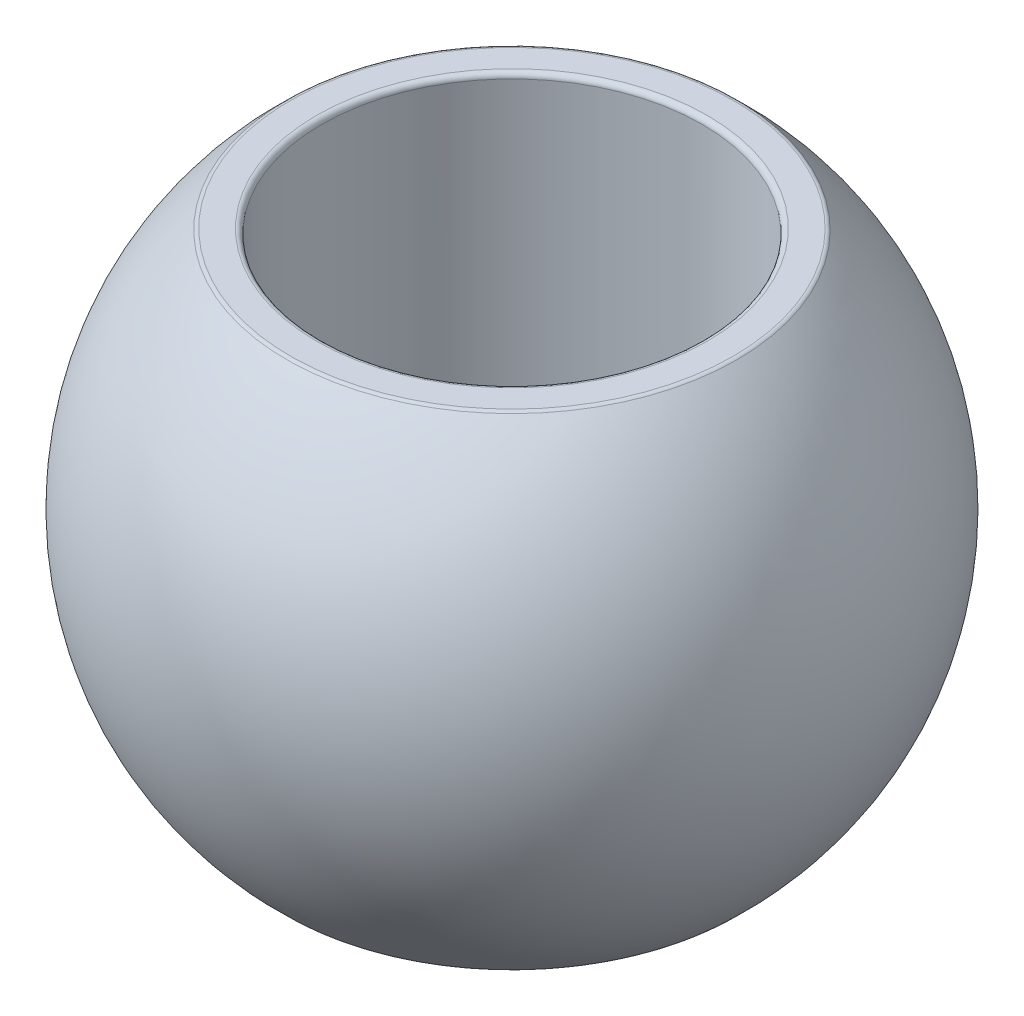
ISO-10303-21;
HEADER;
FILE_DESCRIPTION(('STEP AP214'),'2;1');
FILE_NAME('part.step','',(''),(''),'','','');
FILE_SCHEMA(('AUTOMOTIVE_DESIGN { 1 0 10303 214 1 1 1 1 }'));
ENDSEC;
DATA;
#1=APPLICATION_CONTEXT('core data for automotive mechanical design processes');
#2=APPLICATION_PROTOCOL_DEFINITION('international standard','automotive_design',2000,#1);
#3=PRODUCT_CONTEXT('',#1,'mechanical');
#4=PRODUCT('Part','Part','',(#3));
#5=PRODUCT_RELATED_PRODUCT_CATEGORY('part','',(#4));
#6=PRODUCT_DEFINITION_FORMATION('','',#4);
#7=PRODUCT_DEFINITION_CONTEXT('part definition',#1,'design');
#8=PRODUCT_DEFINITION('design','',#6,#7);
#9=PRODUCT_DEFINITION_SHAPE('','',#8);
#10=(LENGTH_UNIT() NAMED_UNIT(*) SI_UNIT(.MILLI.,.METRE.));
#11=(NAMED_UNIT(*) PLANE_ANGLE_UNIT() SI_UNIT($,.RADIAN.));
#12=(NAMED_UNIT(*) SI_UNIT($,.STERADIAN.) SOLID_ANGLE_UNIT());
#13=UNCERTAINTY_MEASURE_WITH_UNIT(LENGTH_MEASURE(1.E-05),#10,'distance_accuracy_value','');
#14=(GEOMETRIC_REPRESENTATION_CONTEXT(3) GLOBAL_UNCERTAINTY_ASSIGNED_CONTEXT((#13)) GLOBAL_UNIT_ASSIGNED_CONTEXT((#10,
#11,#12)) REPRESENTATION_CONTEXT('',''));
#15=CARTESIAN_POINT('',(0.,0.,0.));
#16=DIRECTION('',(0.,0.,1.));
#17=DIRECTION('',(1.,0.,0.));
#18=AXIS2_PLACEMENT_3D('',#15,#16,#17);
#19=CARTESIAN_POINT('',(0.,0.,0.));
#20=DIRECTION('',(0.,1.,0.));
#21=DIRECTION('',(1.,0.,0.));
#22=AXIS2_PLACEMENT_3D('',#19,#20,#21);
#23=SPHERICAL_SURFACE('',#22,19.05);
#24=CARTESIAN_POINT('',(0.,-13.9192,0.));
#25=DIRECTION('',(0.,1.,0.));
#26=DIRECTION('',(-1.,0.,0.));
#27=AXIS2_PLACEMENT_3D('',#24,#25,#26);
#28=CIRCLE('',#27,13.0060897797916);
#29=CARTESIAN_POINT('',(13.0060897797916,-13.9192,0.));
#30=VERTEX_POINT('',#29);
#31=EDGE_CURVE('E60',#30,#30,#28,.T.);
#32=CARTESIAN_POINT('',(0.,13.9192,0.));
#33=DIRECTION('',(0.,-1.,0.));
#34=DIRECTION('',(1.,0.,0.));
#35=AXIS2_PLACEMENT_3D('',#32,#33,#34);
#36=CIRCLE('',#35,13.0060897797916);
#37=CARTESIAN_POINT('',(13.0060897797916,13.9192,0.));
#38=VERTEX_POINT('',#37);
#39=EDGE_CURVE('E63',#38,#38,#36,.T.);
#40=CARTESIAN_POINT('',(13.0060897797916,-13.9192,0.));
#41=CARTESIAN_POINT('',(13.2436781468951,-13.69720832707,0.));
#42=CARTESIAN_POINT('',(13.4755717006346,-13.4691230465657,0.));
#43=CARTESIAN_POINT('',(13.9273860276897,-13.0013871060489,0.));
#44=CARTESIAN_POINT('',(14.1473068010051,-12.7617364460365,0.));
#45=CARTESIAN_POINT('',(14.5745924135157,-12.2714915821444,0.));
#46=CARTESIAN_POINT('',(14.7819572527109,-12.0208973782648,0.));
#47=CARTESIAN_POINT('',(15.1835891685933,-11.5094240745473,0.));
#48=CARTESIAN_POINT('',(15.3778562452805,-11.2485449747094,0.));
#49=CARTESIAN_POINT('',(15.7527828900079,-10.7171853119996,0.));
#50=CARTESIAN_POINT('',(15.9334424580481,-10.4467047491278,0.));
#51=CARTESIAN_POINT('',(16.2806806151524,-9.89685134671473,0.));
#52=CARTESIAN_POINT('',(16.4472592042165,-9.6174785071736,0.));
#53=CARTESIAN_POINT('',(16.7658986844473,-9.05057289254917,0.));
#54=CARTESIAN_POINT('',(16.917959575614,-8.76304011746588,0.));
#55=CARTESIAN_POINT('',(17.2071650425348,-8.18056840598082,0.));
#56=CARTESIAN_POINT('',(17.3443096182889,-7.88562946957907,0.));
#57=CARTESIAN_POINT('',(17.6033229282809,-7.28911861366565,0.));
#58=CARTESIAN_POINT('',(17.7251916625187,-6.98754669415399,0.));
#59=CARTESIAN_POINT('',(17.9533338120104,-6.37856044155972,0.));
#60=CARTESIAN_POINT('',(18.0596072272641,-6.07114610847711,0.));
#61=CARTESIAN_POINT('',(18.2562801435168,-5.45128091332497,0.));
#62=CARTESIAN_POINT('',(18.3466796445158,-5.13883005125544,0.));
#63=CARTESIAN_POINT('',(18.5113677505789,-4.50971088615863,0.));
#64=CARTESIAN_POINT('',(18.585656355643,-4.19304258313136,0.));
#65=CARTESIAN_POINT('',(18.7179279227096,-3.55631868008553,0.));
#66=CARTESIAN_POINT('',(18.775910884712,-3.23626308006697,0.));
#67=CARTESIAN_POINT('',(18.8754191636857,-2.59360360679846,0.));
#68=CARTESIAN_POINT('',(18.9169444806571,-2.2709997335485,0.));
#69=CARTESIAN_POINT('',(18.9834286112086,-1.62408941785527,0.));
#70=CARTESIAN_POINT('',(19.0083874247889,-1.29978297541199,0.));
#71=CARTESIAN_POINT('',(19.0416731191845,-0.650317688645804,0.));
#72=CARTESIAN_POINT('',(19.05,-0.3251588443229,0.));
#73=CARTESIAN_POINT('',(19.05,0.325158844322907,0.));
#74=CARTESIAN_POINT('',(19.0416731191845,0.650317688645811,0.));
#75=CARTESIAN_POINT('',(19.0083874247889,1.29978297541199,0.));
#76=CARTESIAN_POINT('',(18.9834286112086,1.62408941785527,0.));
#77=CARTESIAN_POINT('',(18.9169444806571,2.27099973354851,0.));
#78=CARTESIAN_POINT('',(18.8754191636857,2.59360360679847,0.));
#79=CARTESIAN_POINT('',(18.775910884712,3.23626308006698,0.));
#80=CARTESIAN_POINT('',(18.7179279227096,3.55631868008553,0.));
#81=CARTESIAN_POINT('',(18.585656355643,4.19304258313136,0.));
#82=CARTESIAN_POINT('',(18.5113677505789,4.50971088615864,0.));
#83=CARTESIAN_POINT('',(18.3466796445158,5.13883005125544,0.));
#84=CARTESIAN_POINT('',(18.2562801435168,5.45128091332497,0.));
#85=CARTESIAN_POINT('',(18.0596072272641,6.07114610847711,0.));
#86=CARTESIAN_POINT('',(17.9533338120104,6.37856044155972,0.));
#87=CARTESIAN_POINT('',(17.7251916625187,6.98754669415399,0.));
#88=CARTESIAN_POINT('',(17.6033229282809,7.28911861366565,0.));
#89=CARTESIAN_POINT('',(17.3443096182889,7.88562946957907,0.));
#90=CARTESIAN_POINT('',(17.2071650425348,8.18056840598083,0.));
#91=CARTESIAN_POINT('',(16.917959575614,8.76304011746588,0.));
#92=CARTESIAN_POINT('',(16.7658986844473,9.05057289254918,0.));
#93=CARTESIAN_POINT('',(16.4472592042165,9.61747850717361,0.));
#94=CARTESIAN_POINT('',(16.2806806151524,9.89685134671474,0.));
#95=CARTESIAN_POINT('',(15.9334424580481,10.4467047491278,0.));
#96=CARTESIAN_POINT('',(15.7527828900079,10.7171853119996,0.));
#97=CARTESIAN_POINT('',(15.3778562452805,11.2485449747094,0.));
#98=CARTESIAN_POINT('',(15.1835891685933,11.5094240745473,0.));
#99=CARTESIAN_POINT('',(14.7819572527109,12.0208973782648,0.));
#100=CARTESIAN_POINT('',(14.5745924135157,12.2714915821444,0.));
#101=CARTESIAN_POINT('',(14.1473068010051,12.7617364460365,0.));
#102=CARTESIAN_POINT('',(13.9273860276897,13.0013871060489,0.));
#103=CARTESIAN_POINT('',(13.4755717006346,13.4691230465657,0.));
#104=CARTESIAN_POINT('',(13.2436781468951,13.69720832707,0.));
#105=CARTESIAN_POINT('',(13.0060897797916,13.9192,0.));
#106=B_SPLINE_CURVE_WITH_KNOTS('',3,(#40,#41,#42,#43,#44,#45,#46,#47,#48,#49,#50,#51,#52,#53,
#54,#55,#56,#57,#58,#59,#60,#61,#62,#63,#64,#65,#66,#67,#68,#69,#70,#71,#72,#73,#74,#75,#76,#77,
#78,#79,#80,#81,#82,#83,#84,#85,#86,#87,#88,#89,#90,#91,#92,#93,#94,#95,#96,#97,#98,#99,#100,
#101,#102,#103,#104,#105),.UNSPECIFIED.,.F.,.F.,(4,2,2,2,2,2,2,2,2,2,2,2,2,2,2,2,2,2,2,2,2,2,2,
2,2,2,2,2,2,2,2,2,4),(0.,0.975370000208496,1.95074000041699,2.92611000062549,3.90148000083399,
4.87685000104249,5.85222000125099,6.82759000145948,7.80296000166798,8.77833000187648,
9.75370000208498,10.7290700022935,11.704440002502,12.6798100027105,13.655180002919,
14.6305500031275,15.605920003336,16.5812900035445,17.556660003753,18.5320300039615,
19.50740000417,20.4827700043784,21.4581400045869,22.4335100047954,23.4088800050039,
24.3842500052124,25.3596200054209,26.3349900056294,27.3103600058379,28.2857300060464,
29.2611000062549,30.2364700064634,31.2118400066719),.UNSPECIFIED.);
#107=EDGE_CURVE('BSEAM34',#30,#38,#106,.T.);
#108=ORIENTED_EDGE('',*,*,#31,.T.);
#109=ORIENTED_EDGE('',*,*,#39,.T.);
#110=ORIENTED_EDGE('',*,*,#107,.T.);
#111=ORIENTED_EDGE('',*,*,#107,.F.);
#112=EDGE_LOOP('',(#108,#110,#109,#111));
#113=FACE_BOUND('',#112,.T.);
#114=ADVANCED_FACE('F34',(#113),#23,.T.);
#115=CARTESIAN_POINT('',(12.9190750442901,14.,0.));
#116=DIRECTION('',(0.,-1.,0.));
#117=DIRECTION('',(1.,0.,0.));
#118=AXIS2_PLACEMENT_3D('',#115,#116,#117);
#119=PLANE('',#118);
#120=CARTESIAN_POINT('',(0.,14.,0.));
#121=DIRECTION('',(0.,-1.,0.));
#122=DIRECTION('',(1.,0.,0.));
#123=AXIS2_PLACEMENT_3D('',#120,#121,#122);
#124=CIRCLE('',#123,12.8012694682988);
#125=CARTESIAN_POINT('',(12.8012694682988,14.,0.));
#126=VERTEX_POINT('',#125);
#127=EDGE_CURVE('E45',#126,#126,#124,.F.);
#128=ORIENTED_EDGE('',*,*,#127,.T.);
#129=EDGE_LOOP('',(#128));
#130=FACE_BOUND('',#129,.T.);
#131=CARTESIAN_POINT('',(0.,14.,0.));
#132=DIRECTION('',(0.,-1.,0.));
#133=DIRECTION('',(1.,0.,0.));
#134=AXIS2_PLACEMENT_3D('',#131,#132,#133);
#135=CIRCLE('',#134,11.3);
#136=CARTESIAN_POINT('',(11.3,14.,0.));
#137=VERTEX_POINT('',#136);
#138=EDGE_CURVE('E49',#137,#137,#135,.T.);
#139=ORIENTED_EDGE('',*,*,#138,.T.);
#140=EDGE_LOOP('',(#139));
#141=FACE_BOUND('',#140,.T.);
#142=ADVANCED_FACE('F76',(#130,#141),#119,.F.);
#143=CARTESIAN_POINT('',(0.,14.,0.));
#144=DIRECTION('',(0.,1.,0.));
#145=DIRECTION('',(-1.,0.,0.));
#146=AXIS2_PLACEMENT_3D('',#143,#144,#145);
#147=CYLINDRICAL_SURFACE('',#146,11.);
#148=CARTESIAN_POINT('',(0.,13.7,0.));
#149=DIRECTION('',(0.,-1.,0.));
#150=DIRECTION('',(1.,0.,0.));
#151=AXIS2_PLACEMENT_3D('',#148,#149,#150);
#152=CIRCLE('',#151,11.);
#153=CARTESIAN_POINT('',(11.,13.7,0.));
#154=VERTEX_POINT('',#153);
#155=EDGE_CURVE('E10',#154,#154,#152,.F.);
#156=ORIENTED_EDGE('',*,*,#155,.T.);
#157=EDGE_LOOP('',(#156));
#158=FACE_BOUND('',#157,.T.);
#159=CARTESIAN_POINT('',(0.,-13.7,0.));
#160=DIRECTION('',(0.,1.,0.));
#161=DIRECTION('',(-1.,0.,0.));
#162=AXIS2_PLACEMENT_3D('',#159,#160,#161);
#163=CIRCLE('',#162,11.);
#164=CARTESIAN_POINT('',(-11.,-13.7,0.));
#165=VERTEX_POINT('',#164);
#166=EDGE_CURVE('E41',#165,#165,#163,.F.);
#167=ORIENTED_EDGE('',*,*,#166,.T.);
#168=EDGE_LOOP('',(#167));
#169=FACE_BOUND('',#168,.T.);
#170=ADVANCED_FACE('F79',(#158,#169),#147,.F.);
#171=CARTESIAN_POINT('',(11.,-14.,0.));
#172=DIRECTION('',(0.,1.,0.));
#173=DIRECTION('',(-1.,0.,0.));
#174=AXIS2_PLACEMENT_3D('',#171,#172,#173);
#175=PLANE('',#174);
#176=CARTESIAN_POINT('',(0.,-14.,0.));
#177=DIRECTION('',(0.,1.,0.));
#178=DIRECTION('',(-1.,0.,0.));
#179=AXIS2_PLACEMENT_3D('',#176,#177,#178);
#180=CIRCLE('',#179,12.8012694682988);
#181=CARTESIAN_POINT('',(-12.8012694682988,-14.,0.));
#182=VERTEX_POINT('',#181);
#183=EDGE_CURVE('E54',#182,#182,#180,.F.);
#184=ORIENTED_EDGE('',*,*,#183,.T.);
#185=EDGE_LOOP('',(#184));
#186=FACE_BOUND('',#185,.T.);
#187=CARTESIAN_POINT('',(0.,-14.,0.));
#188=DIRECTION('',(0.,1.,0.));
#189=DIRECTION('',(-1.,0.,0.));
#190=AXIS2_PLACEMENT_3D('',#187,#188,#189);
#191=CIRCLE('',#190,11.3);
#192=CARTESIAN_POINT('',(-11.3,-14.,0.));
#193=VERTEX_POINT('',#192);
#194=EDGE_CURVE('E57',#193,#193,#191,.T.);
#195=ORIENTED_EDGE('',*,*,#194,.T.);
#196=EDGE_LOOP('',(#195));
#197=FACE_BOUND('',#196,.T.);
#198=ADVANCED_FACE('F97',(#186,#197),#175,.F.);
#199=CARTESIAN_POINT('',(0.,-13.7,0.));
#200=DIRECTION('',(0.,1.,0.));
#201=DIRECTION('',(-1.,0.,0.));
#202=AXIS2_PLACEMENT_3D('',#199,#200,#201);
#203=TOROIDAL_SURFACE('',#202,12.8012694682988,0.3);
#204=ORIENTED_EDGE('',*,*,#183,.F.);
#205=EDGE_LOOP('',(#204));
#206=FACE_BOUND('',#205,.T.);
#207=ORIENTED_EDGE('',*,*,#31,.F.);
#208=EDGE_LOOP('',(#207));
#209=FACE_BOUND('',#208,.T.);
#210=ADVANCED_FACE('F72',(#206,#209),#203,.T.);
#211=CARTESIAN_POINT('',(0.,13.7,0.));
#212=DIRECTION('',(0.,-1.,0.));
#213=DIRECTION('',(1.,0.,0.));
#214=AXIS2_PLACEMENT_3D('',#211,#212,#213);
#215=TOROIDAL_SURFACE('',#214,12.8012694682988,0.3);
#216=ORIENTED_EDGE('',*,*,#39,.F.);
#217=EDGE_LOOP('',(#216));
#218=FACE_BOUND('',#217,.T.);
#219=ORIENTED_EDGE('',*,*,#127,.F.);
#220=EDGE_LOOP('',(#219));
#221=FACE_BOUND('',#220,.T.);
#222=ADVANCED_FACE('F68',(#218,#221),#215,.T.);
#223=CARTESIAN_POINT('',(0.,13.7,0.));
#224=DIRECTION('',(0.,-1.,0.));
#225=DIRECTION('',(1.,0.,0.));
#226=AXIS2_PLACEMENT_3D('',#223,#224,#225);
#227=TOROIDAL_SURFACE('',#226,11.3,0.3);
#228=ORIENTED_EDGE('',*,*,#138,.F.);
#229=EDGE_LOOP('',(#228));
#230=FACE_BOUND('',#229,.T.);
#231=ORIENTED_EDGE('',*,*,#155,.F.);
#232=EDGE_LOOP('',(#231));
#233=FACE_BOUND('',#232,.T.);
#234=ADVANCED_FACE('F71',(#230,#233),#227,.T.);
#235=CARTESIAN_POINT('',(0.,-13.7,0.));
#236=DIRECTION('',(0.,1.,0.));
#237=DIRECTION('',(-1.,0.,0.));
#238=AXIS2_PLACEMENT_3D('',#235,#236,#237);
#239=TOROIDAL_SURFACE('',#238,11.3,0.3);
#240=ORIENTED_EDGE('',*,*,#166,.F.);
#241=EDGE_LOOP('',(#240));
#242=FACE_BOUND('',#241,.T.);
#243=ORIENTED_EDGE('',*,*,#194,.F.);
#244=EDGE_LOOP('',(#243));
#245=FACE_BOUND('',#244,.T.);
#246=ADVANCED_FACE('F36',(#242,#245),#239,.T.);
#247=CLOSED_SHELL('',(#114,#142,#170,#198,#210,#222,#234,#246));
#248=MANIFOLD_SOLID_BREP('B2',#247);
#249=ADVANCED_BREP_SHAPE_REPRESENTATION('',(#18,#248),#14);
#250=SHAPE_DEFINITION_REPRESENTATION(#9,#249);
ENDSEC;
END-ISO-10303-21;
